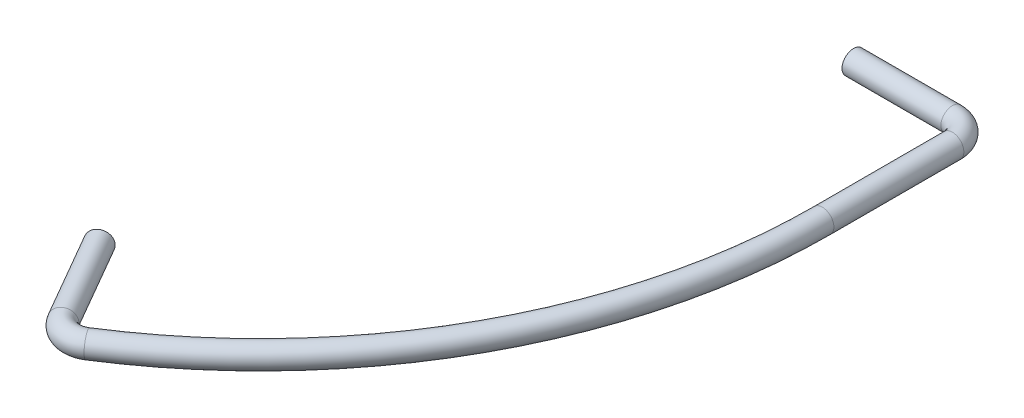
ISO-10303-21;
HEADER;
FILE_DESCRIPTION(('STEP AP214'),'2;1');
FILE_NAME('part.step','',(''),(''),'','','');
FILE_SCHEMA(('AUTOMOTIVE_DESIGN { 1 0 10303 214 1 1 1 1 }'));
ENDSEC;
DATA;
#1=APPLICATION_CONTEXT('core data for automotive mechanical design processes');
#2=APPLICATION_PROTOCOL_DEFINITION('international standard','automotive_design',2000,#1);
#3=PRODUCT_CONTEXT('',#1,'mechanical');
#4=PRODUCT('Part','Part','',(#3));
#5=PRODUCT_RELATED_PRODUCT_CATEGORY('part','',(#4));
#6=PRODUCT_DEFINITION_FORMATION('','',#4);
#7=PRODUCT_DEFINITION_CONTEXT('part definition',#1,'design');
#8=PRODUCT_DEFINITION('design','',#6,#7);
#9=PRODUCT_DEFINITION_SHAPE('','',#8);
#10=(LENGTH_UNIT() NAMED_UNIT(*) SI_UNIT(.MILLI.,.METRE.));
#11=(NAMED_UNIT(*) PLANE_ANGLE_UNIT() SI_UNIT($,.RADIAN.));
#12=(NAMED_UNIT(*) SI_UNIT($,.STERADIAN.) SOLID_ANGLE_UNIT());
#13=UNCERTAINTY_MEASURE_WITH_UNIT(LENGTH_MEASURE(1.E-05),#10,'distance_accuracy_value','');
#14=(GEOMETRIC_REPRESENTATION_CONTEXT(3) GLOBAL_UNCERTAINTY_ASSIGNED_CONTEXT((#13)) GLOBAL_UNIT_ASSIGNED_CONTEXT((#10,
#11,#12)) REPRESENTATION_CONTEXT('',''));
#15=CARTESIAN_POINT('',(0.,0.,0.));
#16=DIRECTION('',(0.,0.,1.));
#17=DIRECTION('',(1.,0.,0.));
#18=AXIS2_PLACEMENT_3D('',#15,#16,#17);
#19=CARTESIAN_POINT('',(575.638587087566,0.,-200.));
#20=DIRECTION('',(-1.,0.,0.));
#21=DIRECTION('',(0.,0.,1.));
#22=AXIS2_PLACEMENT_3D('',#19,#20,#21);
#23=PLANE('',#22);
#24=CARTESIAN_POINT('',(575.638587087566,0.,-200.));
#25=DIRECTION('',(-1.,0.,0.));
#26=DIRECTION('',(0.,0.,1.));
#27=AXIS2_PLACEMENT_3D('',#24,#25,#26);
#28=CIRCLE('',#27,15.);
#29=CARTESIAN_POINT('',(575.638587087566,0.,-185.));
#30=VERTEX_POINT('',#29);
#31=EDGE_CURVE('E48',#30,#30,#28,.T.);
#32=ORIENTED_EDGE('',*,*,#31,.T.);
#33=EDGE_LOOP('',(#32));
#34=FACE_BOUND('',#33,.T.);
#35=ADVANCED_FACE('F36',(#34),#23,.T.);
#36=CARTESIAN_POINT('',(287.500000000001,0.,497.964607176052));
#37=DIRECTION('',(0.500000000000001,0.,0.866025403784438));
#38=DIRECTION('',(0.866025403784438,0.,-0.500000000000001));
#39=AXIS2_PLACEMENT_3D('',#36,#37,#38);
#40=PLANE('',#39);
#41=CARTESIAN_POINT('',(287.500000000001,0.,497.964607176052));
#42=DIRECTION('',(0.500000000000001,0.,0.866025403784438));
#43=DIRECTION('',(0.866025403784438,0.,-0.500000000000001));
#44=AXIS2_PLACEMENT_3D('',#41,#42,#43);
#45=CIRCLE('',#44,15.);
#46=CARTESIAN_POINT('',(300.490381056767,0.,490.464607176052));
#47=VERTEX_POINT('',#46);
#48=EDGE_CURVE('E11',#47,#47,#45,.T.);
#49=ORIENTED_EDGE('',*,*,#48,.F.);
#50=EDGE_LOOP('',(#49));
#51=FACE_BOUND('',#50,.T.);
#52=ADVANCED_FACE('F54',(#51),#40,.F.);
#53=CARTESIAN_POINT('',(575.638587087566,0.,-200.));
#54=DIRECTION('',(1.,0.,0.));
#55=DIRECTION('',(0.,0.,-1.));
#56=AXIS2_PLACEMENT_3D('',#53,#54,#55);
#57=CYLINDRICAL_SURFACE('',#56,15.);
#58=CARTESIAN_POINT('',(705.,0.,-200.));
#59=DIRECTION('',(-1.,0.,0.));
#60=DIRECTION('',(0.,0.,1.));
#61=AXIS2_PLACEMENT_3D('',#58,#59,#60);
#62=CIRCLE('',#61,15.);
#63=CARTESIAN_POINT('',(705.,0.,-214.999999999996));
#64=VERTEX_POINT('',#63);
#65=EDGE_CURVE('E92',#64,#64,#62,.T.);
#66=ORIENTED_EDGE('',*,*,#65,.T.);
#67=EDGE_LOOP('',(#66));
#68=FACE_BOUND('',#67,.T.);
#69=ORIENTED_EDGE('',*,*,#31,.F.);
#70=EDGE_LOOP('',(#69));
#71=FACE_BOUND('',#70,.T.);
#72=ADVANCED_FACE('F56',(#68,#71),#57,.T.);
#73=CARTESIAN_POINT('',(705.,0.,-170.));
#74=DIRECTION('',(0.,-1.,0.));
#75=DIRECTION('',(0.,0.,-1.));
#76=AXIS2_PLACEMENT_3D('',#73,#74,#75);
#77=TOROIDAL_SURFACE('',#76,29.999999999996,15.);
#78=CARTESIAN_POINT('',(735.,0.,-170.));
#79=DIRECTION('',(0.,0.,-1.));
#80=DIRECTION('',(-1.,0.,0.));
#81=AXIS2_PLACEMENT_3D('',#78,#79,#80);
#82=CIRCLE('',#81,15.);
#83=CARTESIAN_POINT('',(749.999999999996,0.,-170.));
#84=VERTEX_POINT('',#83);
#85=EDGE_CURVE('E89',#84,#84,#82,.T.);
#86=CARTESIAN_POINT('',(705.,0.,-170.));
#87=DIRECTION('',(0.,-1.,0.));
#88=DIRECTION('',(0.,0.,-1.));
#89=AXIS2_PLACEMENT_3D('',#86,#87,#88);
#90=CIRCLE('',#89,44.999999999996);
#91=EDGE_CURVE('',#64,#84,#90,.T.);
#92=ORIENTED_EDGE('',*,*,#65,.F.);
#93=ORIENTED_EDGE('',*,*,#85,.T.);
#94=ORIENTED_EDGE('',*,*,#91,.T.);
#95=ORIENTED_EDGE('',*,*,#91,.F.);
#96=EDGE_LOOP('',(#92,#94,#93,#95));
#97=FACE_BOUND('',#96,.T.);
#98=ADVANCED_FACE('F61',(#97),#77,.T.);
#99=CARTESIAN_POINT('',(735.,0.,-170.));
#100=DIRECTION('',(0.,0.,1.));
#101=DIRECTION('',(1.,0.,0.));
#102=AXIS2_PLACEMENT_3D('',#99,#100,#101);
#103=CYLINDRICAL_SURFACE('',#102,15.);
#104=CARTESIAN_POINT('',(735.,0.,0.));
#105=DIRECTION('',(0.,0.,-1.));
#106=DIRECTION('',(-1.,0.,0.));
#107=AXIS2_PLACEMENT_3D('',#104,#105,#106);
#108=CIRCLE('',#107,15.);
#109=CARTESIAN_POINT('',(750.,0.,0.));
#110=VERTEX_POINT('',#109);
#111=EDGE_CURVE('E94',#110,#110,#108,.T.);
#112=ORIENTED_EDGE('',*,*,#111,.T.);
#113=EDGE_LOOP('',(#112));
#114=FACE_BOUND('',#113,.T.);
#115=ORIENTED_EDGE('',*,*,#85,.F.);
#116=EDGE_LOOP('',(#115));
#117=FACE_BOUND('',#116,.T.);
#118=ADVANCED_FACE('F77',(#114,#117),#103,.T.);
#119=CARTESIAN_POINT('',(0.,0.,0.));
#120=DIRECTION('',(0.,-1.,0.));
#121=DIRECTION('',(0.,0.,-1.));
#122=AXIS2_PLACEMENT_3D('',#119,#120,#121);
#123=TOROIDAL_SURFACE('',#122,735.,15.);
#124=CARTESIAN_POINT('',(394.253445955698,0.,620.313807965015));
#125=DIRECTION('',(0.843964364578252,0.,-0.536399246198228));
#126=DIRECTION('',(-0.536399246198228,0.,-0.843964364578252));
#127=AXIS2_PLACEMENT_3D('',#124,#125,#126);
#128=CIRCLE('',#127,15.);
#129=CARTESIAN_POINT('',(402.299434648672,0.,632.973273433689));
#130=VERTEX_POINT('',#129);
#131=EDGE_CURVE('E100',#130,#130,#128,.T.);
#132=CARTESIAN_POINT('',(0.,0.,0.));
#133=DIRECTION('',(0.,-1.,0.));
#134=DIRECTION('',(0.,0.,-1.));
#135=AXIS2_PLACEMENT_3D('',#132,#133,#134);
#136=CIRCLE('',#135,750.);
#137=EDGE_CURVE('',#110,#130,#136,.T.);
#138=ORIENTED_EDGE('',*,*,#111,.F.);
#139=ORIENTED_EDGE('',*,*,#131,.T.);
#140=ORIENTED_EDGE('',*,*,#137,.T.);
#141=ORIENTED_EDGE('',*,*,#137,.F.);
#142=EDGE_LOOP('',(#138,#140,#139,#141));
#143=FACE_BOUND('',#142,.T.);
#144=ADVANCED_FACE('F71',(#143),#123,.T.);
#145=CARTESIAN_POINT('',(378.161468569751,0.,594.994877027668));
#146=DIRECTION('',(0.,-1.,0.));
#147=DIRECTION('',(0.,0.,-1.));
#148=AXIS2_PLACEMENT_3D('',#145,#146,#147);
#149=TOROIDAL_SURFACE('',#148,30.,15.);
#150=CARTESIAN_POINT('',(352.180706456218,0.,609.994877027667));
#151=DIRECTION('',(0.500000000000001,0.,0.866025403784438));
#152=DIRECTION('',(0.866025403784438,0.,-0.500000000000001));
#153=AXIS2_PLACEMENT_3D('',#150,#151,#152);
#154=CIRCLE('',#153,15.);
#155=CARTESIAN_POINT('',(339.190325399451,0.,617.494877027668));
#156=VERTEX_POINT('',#155);
#157=EDGE_CURVE('E43',#156,#156,#154,.T.);
#158=CARTESIAN_POINT('',(378.161468569751,0.,594.994877027668));
#159=DIRECTION('',(0.,-1.,0.));
#160=DIRECTION('',(0.,0.,-1.));
#161=AXIS2_PLACEMENT_3D('',#158,#159,#160);
#162=CIRCLE('',#161,45.0000000000001);
#163=EDGE_CURVE('',#130,#156,#162,.T.);
#164=ORIENTED_EDGE('',*,*,#131,.F.);
#165=ORIENTED_EDGE('',*,*,#157,.T.);
#166=ORIENTED_EDGE('',*,*,#163,.T.);
#167=ORIENTED_EDGE('',*,*,#163,.F.);
#168=EDGE_LOOP('',(#164,#166,#165,#167));
#169=FACE_BOUND('',#168,.T.);
#170=ADVANCED_FACE('F67',(#169),#149,.T.);
#171=CARTESIAN_POINT('',(352.180706456218,0.,609.994877027667));
#172=DIRECTION('',(-0.500000000000001,0.,-0.866025403784438));
#173=DIRECTION('',(-0.866025403784438,0.,0.500000000000001));
#174=AXIS2_PLACEMENT_3D('',#171,#172,#173);
#175=CYLINDRICAL_SURFACE('',#174,15.);
#176=ORIENTED_EDGE('',*,*,#48,.T.);
#177=EDGE_LOOP('',(#176));
#178=FACE_BOUND('',#177,.T.);
#179=ORIENTED_EDGE('',*,*,#157,.F.);
#180=EDGE_LOOP('',(#179));
#181=FACE_BOUND('',#180,.T.);
#182=ADVANCED_FACE('F51',(#178,#181),#175,.T.);
#183=CLOSED_SHELL('',(#35,#52,#72,#98,#118,#144,#170,#182));
#184=MANIFOLD_SOLID_BREP('B2',#183);
#185=ADVANCED_BREP_SHAPE_REPRESENTATION('',(#18,#184),#14);
#186=SHAPE_DEFINITION_REPRESENTATION(#9,#185);
ENDSEC;
END-ISO-10303-21;
